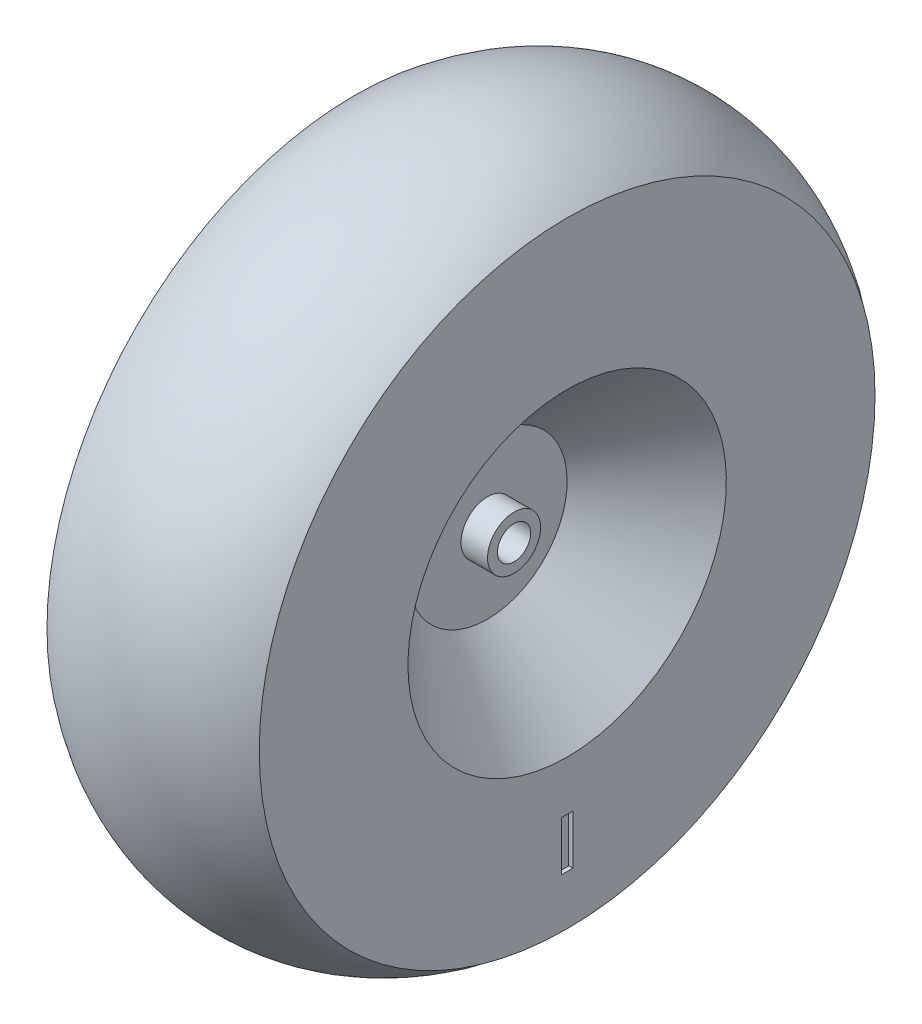
ISO-10303-21;
HEADER;
FILE_DESCRIPTION(('STEP AP214'),'2;1');
FILE_NAME('part.step','',(''),(''),'','','');
FILE_SCHEMA(('AUTOMOTIVE_DESIGN { 1 0 10303 214 1 1 1 1 }'));
ENDSEC;
DATA;
#1=APPLICATION_CONTEXT('core data for automotive mechanical design processes');
#2=APPLICATION_PROTOCOL_DEFINITION('international standard','automotive_design',2000,#1);
#3=PRODUCT_CONTEXT('',#1,'mechanical');
#4=PRODUCT('Part','Part','',(#3));
#5=PRODUCT_RELATED_PRODUCT_CATEGORY('part','',(#4));
#6=PRODUCT_DEFINITION_FORMATION('','',#4);
#7=PRODUCT_DEFINITION_CONTEXT('part definition',#1,'design');
#8=PRODUCT_DEFINITION('design','',#6,#7);
#9=PRODUCT_DEFINITION_SHAPE('','',#8);
#10=(LENGTH_UNIT() NAMED_UNIT(*) SI_UNIT(.MILLI.,.METRE.));
#11=(NAMED_UNIT(*) PLANE_ANGLE_UNIT() SI_UNIT($,.RADIAN.));
#12=(NAMED_UNIT(*) SI_UNIT($,.STERADIAN.) SOLID_ANGLE_UNIT());
#13=UNCERTAINTY_MEASURE_WITH_UNIT(LENGTH_MEASURE(1.E-05),#10,'distance_accuracy_value','');
#14=(GEOMETRIC_REPRESENTATION_CONTEXT(3) GLOBAL_UNCERTAINTY_ASSIGNED_CONTEXT((#13)) GLOBAL_UNIT_ASSIGNED_CONTEXT((#10,
#11,#12)) REPRESENTATION_CONTEXT('',''));
#15=CARTESIAN_POINT('',(0.,0.,0.));
#16=DIRECTION('',(0.,0.,1.));
#17=DIRECTION('',(1.,0.,0.));
#18=AXIS2_PLACEMENT_3D('',#15,#16,#17);
#19=CARTESIAN_POINT('',(50.8,0.,0.));
#20=DIRECTION('',(-1.,0.,0.));
#21=DIRECTION('',(0.,-1.,0.));
#22=AXIS2_PLACEMENT_3D('',#19,#20,#21);
#23=PLANE('',#22);
#24=DIRECTION('',(0.,0.,1.));
#25=VECTOR('',#24,1.);
#26=CARTESIAN_POINT('',(50.8,-99.9195503599481,2.75281848297482));
#27=LINE('',#26,#25);
#28=CARTESIAN_POINT('',(50.8,-99.9195503599481,-2.75281848297482));
#29=VERTEX_POINT('',#28);
#30=CARTESIAN_POINT('',(50.8,-99.9195503599481,2.75281848297482));
#31=VERTEX_POINT('',#30);
#32=EDGE_CURVE('E98',#29,#31,#27,.T.);
#33=ORIENTED_EDGE('',*,*,#32,.F.);
#34=DIRECTION('',(0.,1.,0.));
#35=VECTOR('',#34,1.);
#36=CARTESIAN_POINT('',(50.8,-123.639100719896,-2.75281848297482));
#37=LINE('',#36,#35);
#38=CARTESIAN_POINT('',(50.8,-123.639100719896,-2.75281848297482));
#39=VERTEX_POINT('',#38);
#40=EDGE_CURVE('E63',#39,#29,#37,.T.);
#41=ORIENTED_EDGE('',*,*,#40,.F.);
#42=DIRECTION('',(0.,0.,-1.));
#43=VECTOR('',#42,1.);
#44=CARTESIAN_POINT('',(50.8,-123.639100719896,2.75281848297482));
#45=LINE('',#44,#43);
#46=CARTESIAN_POINT('',(50.8,-123.639100719896,2.75281848297482));
#47=VERTEX_POINT('',#46);
#48=EDGE_CURVE('E114',#47,#39,#45,.T.);
#49=ORIENTED_EDGE('',*,*,#48,.F.);
#50=DIRECTION('',(0.,-1.,0.));
#51=VECTOR('',#50,1.);
#52=CARTESIAN_POINT('',(50.8,-123.639100719896,2.75281848297482));
#53=LINE('',#52,#51);
#54=EDGE_CURVE('E120',#31,#47,#53,.T.);
#55=ORIENTED_EDGE('',*,*,#54,.F.);
#56=EDGE_LOOP('',(#33,#41,#49,#55));
#57=FACE_BOUND('',#56,.T.);
#58=CARTESIAN_POINT('',(50.8,0.,0.));
#59=DIRECTION('',(-1.,0.,0.));
#60=DIRECTION('',(0.,-1.,0.));
#61=AXIS2_PLACEMENT_3D('',#58,#59,#60);
#62=CIRCLE('',#61,147.358651079845);
#63=CARTESIAN_POINT('',(50.8,-147.358651079845,0.));
#64=VERTEX_POINT('',#63);
#65=EDGE_CURVE('E11',#64,#64,#62,.T.);
#66=ORIENTED_EDGE('',*,*,#65,.F.);
#67=EDGE_LOOP('',(#66));
#68=FACE_BOUND('',#67,.T.);
#69=CARTESIAN_POINT('',(50.8,0.,0.));
#70=DIRECTION('',(-1.,0.,0.));
#71=DIRECTION('',(0.,-1.,0.));
#72=AXIS2_PLACEMENT_3D('',#69,#70,#71);
#73=CIRCLE('',#72,76.2);
#74=CARTESIAN_POINT('',(50.8,-76.2,0.));
#75=VERTEX_POINT('',#74);
#76=EDGE_CURVE('E124',#75,#75,#73,.T.);
#77=ORIENTED_EDGE('',*,*,#76,.T.);
#78=EDGE_LOOP('',(#77));
#79=FACE_BOUND('',#78,.T.);
#80=ADVANCED_FACE('F49',(#57,#68,#79),#23,.F.);
#81=CARTESIAN_POINT('',(0.,79.5701073445165,0.));
#82=DIRECTION('',(0.,0.,1.));
#83=DIRECTION('',(0.,-1.,0.));
#84=AXIS2_PLACEMENT_3D('',#81,#82,#83);
#85=ELLIPSE('',#84,85.5298926554835,83.3088481565609);
#86=TRIMMED_CURVE('',#85,(PARAMETER_VALUE(0.375513902886624)),
(PARAMETER_VALUE(5.90767140429296)),.T.,.PARAMETER.);
#87=CARTESIAN_POINT('',(-25.4,0.,0.));
#88=DIRECTION('',(-1.,0.,0.));
#89=AXIS1_PLACEMENT('',#87,#88);
#90=SURFACE_OF_REVOLUTION('',#86,#89);
#91=CARTESIAN_POINT('',(-50.8,0.,0.));
#92=DIRECTION('',(-1.,0.,0.));
#93=DIRECTION('',(0.,-1.,0.));
#94=AXIS2_PLACEMENT_3D('',#91,#92,#93);
#95=CIRCLE('',#94,147.358651079845);
#96=CARTESIAN_POINT('',(-50.7999999999999,-147.358651079845,0.));
#97=VERTEX_POINT('',#96);
#98=EDGE_CURVE('E56',#97,#97,#95,.T.);
#99=ORIENTED_EDGE('',*,*,#98,.F.);
#100=EDGE_LOOP('',(#99));
#101=FACE_BOUND('',#100,.T.);
#102=ORIENTED_EDGE('',*,*,#65,.T.);
#103=EDGE_LOOP('',(#102));
#104=FACE_BOUND('',#103,.T.);
#105=ADVANCED_FACE('F130',(#101,#104),#90,.T.);
#106=CARTESIAN_POINT('',(-50.8,0.,0.));
#107=DIRECTION('',(-1.,0.,0.));
#108=DIRECTION('',(0.,-1.,0.));
#109=AXIS2_PLACEMENT_3D('',#106,#107,#108);
#110=PLANE('',#109);
#111=ORIENTED_EDGE('',*,*,#98,.T.);
#112=EDGE_LOOP('',(#111));
#113=FACE_BOUND('',#112,.T.);
#114=CARTESIAN_POINT('',(-50.8,0.,0.));
#115=DIRECTION('',(-1.,0.,0.));
#116=DIRECTION('',(0.,-1.,0.));
#117=AXIS2_PLACEMENT_3D('',#114,#115,#116);
#118=CIRCLE('',#117,76.2);
#119=CARTESIAN_POINT('',(-50.8,-76.2,0.));
#120=VERTEX_POINT('',#119);
#121=EDGE_CURVE('E222',#120,#120,#118,.T.);
#122=ORIENTED_EDGE('',*,*,#121,.F.);
#123=EDGE_LOOP('',(#122));
#124=FACE_BOUND('',#123,.T.);
#125=ADVANCED_FACE('F133',(#113,#124),#110,.T.);
#126=CARTESIAN_POINT('',(-12.7,0.,0.));
#127=DIRECTION('',(-1.,0.,0.));
#128=DIRECTION('',(0.,-1.,0.));
#129=AXIS2_PLACEMENT_3D('',#126,#127,#128);
#130=CONICAL_SURFACE('',#129,38.0999999999999,0.78539816339745);
#131=ORIENTED_EDGE('',*,*,#121,.T.);
#132=EDGE_LOOP('',(#131));
#133=FACE_BOUND('',#132,.T.);
#134=CARTESIAN_POINT('',(-12.7,0.,0.));
#135=DIRECTION('',(-1.,0.,0.));
#136=DIRECTION('',(0.,-1.,0.));
#137=AXIS2_PLACEMENT_3D('',#134,#135,#136);
#138=CIRCLE('',#137,38.0999999999999);
#139=CARTESIAN_POINT('',(-12.7,-38.0999999999999,0.));
#140=VERTEX_POINT('',#139);
#141=EDGE_CURVE('E219',#140,#140,#138,.T.);
#142=ORIENTED_EDGE('',*,*,#141,.F.);
#143=EDGE_LOOP('',(#142));
#144=FACE_BOUND('',#143,.T.);
#145=ADVANCED_FACE('F137',(#133,#144),#130,.F.);
#146=CARTESIAN_POINT('',(-12.7,0.,0.));
#147=DIRECTION('',(-1.,0.,0.));
#148=DIRECTION('',(0.,-1.,0.));
#149=AXIS2_PLACEMENT_3D('',#146,#147,#148);
#150=PLANE('',#149);
#151=ORIENTED_EDGE('',*,*,#141,.T.);
#152=EDGE_LOOP('',(#151));
#153=FACE_BOUND('',#152,.T.);
#154=CARTESIAN_POINT('',(-12.7,0.,0.));
#155=DIRECTION('',(-1.,0.,0.));
#156=DIRECTION('',(0.,-1.,0.));
#157=AXIS2_PLACEMENT_3D('',#154,#155,#156);
#158=CIRCLE('',#157,12.7);
#159=CARTESIAN_POINT('',(-12.7,-12.7,0.));
#160=VERTEX_POINT('',#159);
#161=EDGE_CURVE('E216',#160,#160,#158,.T.);
#162=ORIENTED_EDGE('',*,*,#161,.F.);
#163=EDGE_LOOP('',(#162));
#164=FACE_BOUND('',#163,.T.);
#165=ADVANCED_FACE('F141',(#153,#164),#150,.T.);
#166=CARTESIAN_POINT('',(-25.4,0.,0.));
#167=DIRECTION('',(-1.,0.,0.));
#168=DIRECTION('',(0.,-1.,0.));
#169=AXIS2_PLACEMENT_3D('',#166,#167,#168);
#170=CYLINDRICAL_SURFACE('',#169,12.7);
#171=CARTESIAN_POINT('',(-25.4,0.,0.));
#172=DIRECTION('',(-1.,0.,0.));
#173=DIRECTION('',(0.,-1.,0.));
#174=AXIS2_PLACEMENT_3D('',#171,#172,#173);
#175=CIRCLE('',#174,12.7);
#176=CARTESIAN_POINT('',(-25.4,-12.7,0.));
#177=VERTEX_POINT('',#176);
#178=EDGE_CURVE('E213',#177,#177,#175,.T.);
#179=ORIENTED_EDGE('',*,*,#178,.F.);
#180=EDGE_LOOP('',(#179));
#181=FACE_BOUND('',#180,.T.);
#182=ORIENTED_EDGE('',*,*,#161,.T.);
#183=EDGE_LOOP('',(#182));
#184=FACE_BOUND('',#183,.T.);
#185=ADVANCED_FACE('F145',(#181,#184),#170,.T.);
#186=CARTESIAN_POINT('',(-25.4,0.,0.));
#187=DIRECTION('',(-1.,0.,0.));
#188=DIRECTION('',(0.,-1.,0.));
#189=AXIS2_PLACEMENT_3D('',#186,#187,#188);
#190=PLANE('',#189);
#191=ORIENTED_EDGE('',*,*,#178,.T.);
#192=EDGE_LOOP('',(#191));
#193=FACE_BOUND('',#192,.T.);
#194=CARTESIAN_POINT('',(-25.4,0.,0.));
#195=DIRECTION('',(-1.,0.,0.));
#196=DIRECTION('',(0.,-1.,0.));
#197=AXIS2_PLACEMENT_3D('',#194,#195,#196);
#198=CIRCLE('',#197,7.93749999999999);
#199=CARTESIAN_POINT('',(-25.4,-7.93749999999999,0.));
#200=VERTEX_POINT('',#199);
#201=EDGE_CURVE('E210',#200,#200,#198,.T.);
#202=ORIENTED_EDGE('',*,*,#201,.F.);
#203=EDGE_LOOP('',(#202));
#204=FACE_BOUND('',#203,.T.);
#205=ADVANCED_FACE('F149',(#193,#204),#190,.T.);
#206=CARTESIAN_POINT('',(-25.4,0.,0.));
#207=DIRECTION('',(-1.,0.,0.));
#208=DIRECTION('',(0.,-1.,0.));
#209=AXIS2_PLACEMENT_3D('',#206,#207,#208);
#210=CYLINDRICAL_SURFACE('',#209,7.93749999999999);
#211=ORIENTED_EDGE('',*,*,#201,.T.);
#212=EDGE_LOOP('',(#211));
#213=FACE_BOUND('',#212,.T.);
#214=CARTESIAN_POINT('',(25.4,0.,0.));
#215=DIRECTION('',(-1.,0.,0.));
#216=DIRECTION('',(0.,-1.,0.));
#217=AXIS2_PLACEMENT_3D('',#214,#215,#216);
#218=CIRCLE('',#217,7.93749999999999);
#219=CARTESIAN_POINT('',(25.4,-7.93749999999998,0.));
#220=VERTEX_POINT('',#219);
#221=EDGE_CURVE('E207',#220,#220,#218,.T.);
#222=ORIENTED_EDGE('',*,*,#221,.F.);
#223=EDGE_LOOP('',(#222));
#224=FACE_BOUND('',#223,.T.);
#225=ADVANCED_FACE('F153',(#213,#224),#210,.F.);
#226=CARTESIAN_POINT('',(25.4,0.,0.));
#227=DIRECTION('',(-1.,0.,0.));
#228=DIRECTION('',(0.,-1.,0.));
#229=AXIS2_PLACEMENT_3D('',#226,#227,#228);
#230=PLANE('',#229);
#231=CARTESIAN_POINT('',(25.4,0.,0.));
#232=DIRECTION('',(-1.,0.,0.));
#233=DIRECTION('',(0.,-1.,0.));
#234=AXIS2_PLACEMENT_3D('',#231,#232,#233);
#235=CIRCLE('',#234,12.7);
#236=CARTESIAN_POINT('',(25.4,-12.7,0.));
#237=VERTEX_POINT('',#236);
#238=EDGE_CURVE('E202',#237,#237,#235,.T.);
#239=ORIENTED_EDGE('',*,*,#238,.F.);
#240=EDGE_LOOP('',(#239));
#241=FACE_BOUND('',#240,.T.);
#242=ORIENTED_EDGE('',*,*,#221,.T.);
#243=EDGE_LOOP('',(#242));
#244=FACE_BOUND('',#243,.T.);
#245=ADVANCED_FACE('F157',(#241,#244),#230,.F.);
#246=CARTESIAN_POINT('',(-25.4,0.,0.));
#247=DIRECTION('',(-1.,0.,0.));
#248=DIRECTION('',(0.,-1.,0.));
#249=AXIS2_PLACEMENT_3D('',#246,#247,#248);
#250=CYLINDRICAL_SURFACE('',#249,12.7);
#251=ORIENTED_EDGE('',*,*,#238,.T.);
#252=EDGE_LOOP('',(#251));
#253=FACE_BOUND('',#252,.T.);
#254=CARTESIAN_POINT('',(12.7,0.,0.));
#255=DIRECTION('',(-1.,0.,0.));
#256=DIRECTION('',(0.,-1.,0.));
#257=AXIS2_PLACEMENT_3D('',#254,#255,#256);
#258=CIRCLE('',#257,12.7);
#259=CARTESIAN_POINT('',(12.7,-12.7,0.));
#260=VERTEX_POINT('',#259);
#261=EDGE_CURVE('E198',#260,#260,#258,.T.);
#262=ORIENTED_EDGE('',*,*,#261,.F.);
#263=EDGE_LOOP('',(#262));
#264=FACE_BOUND('',#263,.T.);
#265=ADVANCED_FACE('F161',(#253,#264),#250,.T.);
#266=CARTESIAN_POINT('',(12.7,0.,0.));
#267=DIRECTION('',(-1.,0.,0.));
#268=DIRECTION('',(0.,-1.,0.));
#269=AXIS2_PLACEMENT_3D('',#266,#267,#268);
#270=PLANE('',#269);
#271=CARTESIAN_POINT('',(12.7,0.,0.));
#272=DIRECTION('',(-1.,0.,0.));
#273=DIRECTION('',(0.,-1.,0.));
#274=AXIS2_PLACEMENT_3D('',#271,#272,#273);
#275=CIRCLE('',#274,38.0999999999999);
#276=CARTESIAN_POINT('',(12.7,-38.0999999999999,0.));
#277=VERTEX_POINT('',#276);
#278=EDGE_CURVE('E196',#277,#277,#275,.T.);
#279=ORIENTED_EDGE('',*,*,#278,.F.);
#280=EDGE_LOOP('',(#279));
#281=FACE_BOUND('',#280,.T.);
#282=ORIENTED_EDGE('',*,*,#261,.T.);
#283=EDGE_LOOP('',(#282));
#284=FACE_BOUND('',#283,.T.);
#285=ADVANCED_FACE('F165',(#281,#284),#270,.F.);
#286=CARTESIAN_POINT('',(12.7,0.,0.));
#287=DIRECTION('',(1.,0.,0.));
#288=DIRECTION('',(0.,1.,0.));
#289=AXIS2_PLACEMENT_3D('',#286,#287,#288);
#290=CONICAL_SURFACE('',#289,38.0999999999999,0.78539816339745);
#291=ORIENTED_EDGE('',*,*,#76,.F.);
#292=EDGE_LOOP('',(#291));
#293=FACE_BOUND('',#292,.T.);
#294=ORIENTED_EDGE('',*,*,#278,.T.);
#295=EDGE_LOOP('',(#294));
#296=FACE_BOUND('',#295,.T.);
#297=ADVANCED_FACE('F169',(#293,#296),#290,.F.);
#298=CARTESIAN_POINT('',(48.8,-123.639100719896,-2.75281848297482));
#299=DIRECTION('',(0.,0.,-1.));
#300=DIRECTION('',(-1.,0.,0.));
#301=AXIS2_PLACEMENT_3D('',#298,#299,#300);
#302=PLANE('',#301);
#303=ORIENTED_EDGE('',*,*,#40,.T.);
#304=DIRECTION('',(1.,0.,0.));
#305=VECTOR('',#304,1.);
#306=CARTESIAN_POINT('',(48.8,-99.9195503599481,-2.75281848297482));
#307=LINE('',#306,#305);
#308=CARTESIAN_POINT('',(48.8,-99.9195503599481,-2.75281848297482));
#309=VERTEX_POINT('',#308);
#310=EDGE_CURVE('E86',#309,#29,#307,.T.);
#311=ORIENTED_EDGE('',*,*,#310,.F.);
#312=DIRECTION('',(0.,1.,0.));
#313=VECTOR('',#312,1.);
#314=CARTESIAN_POINT('',(48.8,-123.639100719896,-2.75281848297482));
#315=LINE('',#314,#313);
#316=CARTESIAN_POINT('',(48.8,-123.639100719896,-2.75281848297482));
#317=VERTEX_POINT('',#316);
#318=EDGE_CURVE('E112',#317,#309,#315,.T.);
#319=ORIENTED_EDGE('',*,*,#318,.F.);
#320=DIRECTION('',(1.,0.,0.));
#321=VECTOR('',#320,1.);
#322=CARTESIAN_POINT('',(48.8,-123.639100719896,-2.75281848297482));
#323=LINE('',#322,#321);
#324=EDGE_CURVE('E71',#317,#39,#323,.T.);
#325=ORIENTED_EDGE('',*,*,#324,.T.);
#326=EDGE_LOOP('',(#303,#311,#319,#325));
#327=FACE_BOUND('',#326,.T.);
#328=ADVANCED_FACE('F173',(#327),#302,.F.);
#329=CARTESIAN_POINT('',(48.8,-123.639100719896,2.75281848297482));
#330=DIRECTION('',(0.,-1.,0.));
#331=DIRECTION('',(1.,0.,0.));
#332=AXIS2_PLACEMENT_3D('',#329,#330,#331);
#333=PLANE('',#332);
#334=ORIENTED_EDGE('',*,*,#48,.T.);
#335=ORIENTED_EDGE('',*,*,#324,.F.);
#336=DIRECTION('',(0.,0.,-1.));
#337=VECTOR('',#336,1.);
#338=CARTESIAN_POINT('',(48.8,-123.639100719896,2.75281848297482));
#339=LINE('',#338,#337);
#340=CARTESIAN_POINT('',(48.8,-123.639100719896,2.75281848297482));
#341=VERTEX_POINT('',#340);
#342=EDGE_CURVE('E109',#341,#317,#339,.T.);
#343=ORIENTED_EDGE('',*,*,#342,.F.);
#344=DIRECTION('',(1.,0.,0.));
#345=VECTOR('',#344,1.);
#346=CARTESIAN_POINT('',(48.8,-123.639100719896,2.75281848297482));
#347=LINE('',#346,#345);
#348=EDGE_CURVE('E102',#341,#47,#347,.T.);
#349=ORIENTED_EDGE('',*,*,#348,.T.);
#350=EDGE_LOOP('',(#334,#335,#343,#349));
#351=FACE_BOUND('',#350,.T.);
#352=ADVANCED_FACE('F177',(#351),#333,.F.);
#353=CARTESIAN_POINT('',(48.8,-123.639100719896,2.75281848297482));
#354=DIRECTION('',(0.,0.,1.));
#355=DIRECTION('',(1.,0.,0.));
#356=AXIS2_PLACEMENT_3D('',#353,#354,#355);
#357=PLANE('',#356);
#358=ORIENTED_EDGE('',*,*,#54,.T.);
#359=ORIENTED_EDGE('',*,*,#348,.F.);
#360=DIRECTION('',(0.,-1.,0.));
#361=VECTOR('',#360,1.);
#362=CARTESIAN_POINT('',(48.8,-123.639100719896,2.75281848297482));
#363=LINE('',#362,#361);
#364=CARTESIAN_POINT('',(48.8,-99.9195503599481,2.75281848297482));
#365=VERTEX_POINT('',#364);
#366=EDGE_CURVE('E105',#365,#341,#363,.T.);
#367=ORIENTED_EDGE('',*,*,#366,.F.);
#368=DIRECTION('',(1.,0.,0.));
#369=VECTOR('',#368,1.);
#370=CARTESIAN_POINT('',(48.8,-99.9195503599481,2.75281848297482));
#371=LINE('',#370,#369);
#372=EDGE_CURVE('E91',#365,#31,#371,.T.);
#373=ORIENTED_EDGE('',*,*,#372,.T.);
#374=EDGE_LOOP('',(#358,#359,#367,#373));
#375=FACE_BOUND('',#374,.T.);
#376=ADVANCED_FACE('F106',(#375),#357,.F.);
#377=CARTESIAN_POINT('',(48.8,-99.9195503599481,2.75281848297482));
#378=DIRECTION('',(0.,1.,0.));
#379=DIRECTION('',(-1.,0.,0.));
#380=AXIS2_PLACEMENT_3D('',#377,#378,#379);
#381=PLANE('',#380);
#382=ORIENTED_EDGE('',*,*,#32,.T.);
#383=ORIENTED_EDGE('',*,*,#372,.F.);
#384=DIRECTION('',(0.,0.,1.));
#385=VECTOR('',#384,1.);
#386=CARTESIAN_POINT('',(48.8,-99.9195503599481,2.75281848297482));
#387=LINE('',#386,#385);
#388=EDGE_CURVE('E95',#309,#365,#387,.T.);
#389=ORIENTED_EDGE('',*,*,#388,.F.);
#390=ORIENTED_EDGE('',*,*,#310,.T.);
#391=EDGE_LOOP('',(#382,#383,#389,#390));
#392=FACE_BOUND('',#391,.T.);
#393=ADVANCED_FACE('F93',(#392),#381,.F.);
#394=CARTESIAN_POINT('',(48.8,0.,0.));
#395=DIRECTION('',(-1.,0.,0.));
#396=DIRECTION('',(0.,0.,1.));
#397=AXIS2_PLACEMENT_3D('',#394,#395,#396);
#398=PLANE('',#397);
#399=ORIENTED_EDGE('',*,*,#318,.T.);
#400=ORIENTED_EDGE('',*,*,#388,.T.);
#401=ORIENTED_EDGE('',*,*,#366,.T.);
#402=ORIENTED_EDGE('',*,*,#342,.T.);
#403=EDGE_LOOP('',(#399,#400,#401,#402));
#404=FACE_BOUND('',#403,.T.);
#405=ADVANCED_FACE('F111',(#404),#398,.F.);
#406=CLOSED_SHELL('',(#80,#105,#125,#145,#165,#185,#205,#225,#245,#265,#285,#297,#328,#352,#376,
#393,#405));
#407=MANIFOLD_SOLID_BREP('B2',#406);
#408=ADVANCED_BREP_SHAPE_REPRESENTATION('',(#18,#407),#14);
#409=SHAPE_DEFINITION_REPRESENTATION(#9,#408);
ENDSEC;
END-ISO-10303-21;
